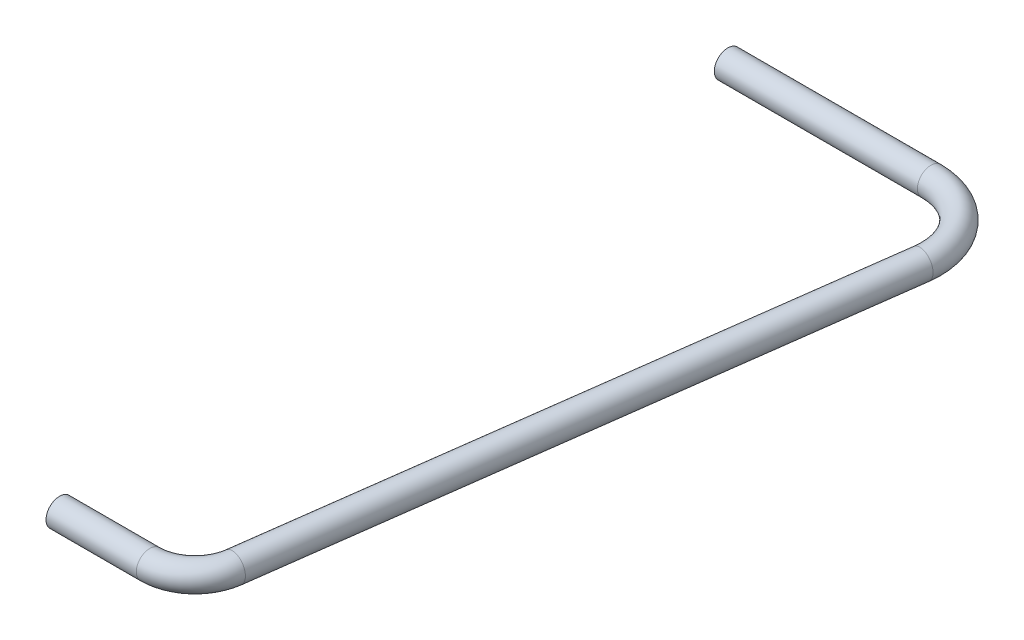
ISO-10303-21;
HEADER;
FILE_DESCRIPTION(('STEP AP214'),'2;1');
FILE_NAME('part.step','',(''),(''),'','','');
FILE_SCHEMA(('AUTOMOTIVE_DESIGN { 1 0 10303 214 1 1 1 1 }'));
ENDSEC;
DATA;
#1=APPLICATION_CONTEXT('core data for automotive mechanical design processes');
#2=APPLICATION_PROTOCOL_DEFINITION('international standard','automotive_design',2000,#1);
#3=PRODUCT_CONTEXT('',#1,'mechanical');
#4=PRODUCT('Part','Part','',(#3));
#5=PRODUCT_RELATED_PRODUCT_CATEGORY('part','',(#4));
#6=PRODUCT_DEFINITION_FORMATION('','',#4);
#7=PRODUCT_DEFINITION_CONTEXT('part definition',#1,'design');
#8=PRODUCT_DEFINITION('design','',#6,#7);
#9=PRODUCT_DEFINITION_SHAPE('','',#8);
#10=(LENGTH_UNIT() NAMED_UNIT(*) SI_UNIT(.MILLI.,.METRE.));
#11=(NAMED_UNIT(*) PLANE_ANGLE_UNIT() SI_UNIT($,.RADIAN.));
#12=(NAMED_UNIT(*) SI_UNIT($,.STERADIAN.) SOLID_ANGLE_UNIT());
#13=UNCERTAINTY_MEASURE_WITH_UNIT(LENGTH_MEASURE(1.E-05),#10,'distance_accuracy_value','');
#14=(GEOMETRIC_REPRESENTATION_CONTEXT(3) GLOBAL_UNCERTAINTY_ASSIGNED_CONTEXT((#13)) GLOBAL_UNIT_ASSIGNED_CONTEXT((#10,
#11,#12)) REPRESENTATION_CONTEXT('',''));
#15=CARTESIAN_POINT('',(0.,0.,0.));
#16=DIRECTION('',(0.,0.,1.));
#17=DIRECTION('',(1.,0.,0.));
#18=AXIS2_PLACEMENT_3D('',#15,#16,#17);
#19=CARTESIAN_POINT('',(-0.572453608804365,0.,-78.5923062806177));
#20=DIRECTION('',(-1.,0.,0.));
#21=DIRECTION('',(0.,0.,1.));
#22=AXIS2_PLACEMENT_3D('',#19,#20,#21);
#23=PLANE('',#22);
#24=CARTESIAN_POINT('',(-0.572453608804365,0.,-78.5923062806177));
#25=DIRECTION('',(-1.,0.,0.));
#26=DIRECTION('',(0.,0.,1.));
#27=AXIS2_PLACEMENT_3D('',#24,#25,#26);
#28=CIRCLE('',#27,3.);
#29=CARTESIAN_POINT('',(-0.572453608804363,0.,-75.5923062806177));
#30=VERTEX_POINT('',#29);
#31=EDGE_CURVE('E71',#30,#30,#28,.T.);
#32=ORIENTED_EDGE('',*,*,#31,.T.);
#33=EDGE_LOOP('',(#32));
#34=FACE_BOUND('',#33,.T.);
#35=ADVANCED_FACE('F49',(#34),#23,.T.);
#36=CARTESIAN_POINT('',(-12.5724536088044,0.,-238.592306280618));
#37=DIRECTION('',(1.,0.,0.));
#38=DIRECTION('',(0.,0.,-1.));
#39=AXIS2_PLACEMENT_3D('',#36,#37,#38);
#40=PLANE('',#39);
#41=CARTESIAN_POINT('',(-12.5724536088044,0.,-238.592306280618));
#42=DIRECTION('',(1.,0.,0.));
#43=DIRECTION('',(0.,0.,-1.));
#44=AXIS2_PLACEMENT_3D('',#41,#42,#43);
#45=CIRCLE('',#44,3.);
#46=CARTESIAN_POINT('',(-12.5724536088044,0.,-241.592306280618));
#47=VERTEX_POINT('',#46);
#48=EDGE_CURVE('E11',#47,#47,#45,.T.);
#49=ORIENTED_EDGE('',*,*,#48,.F.);
#50=EDGE_LOOP('',(#49));
#51=FACE_BOUND('',#50,.T.);
#52=ADVANCED_FACE('F79',(#51),#40,.F.);
#53=CARTESIAN_POINT('',(-0.572453608804365,0.,-78.5923062806177));
#54=DIRECTION('',(1.,0.,0.));
#55=DIRECTION('',(0.,0.,-1.));
#56=AXIS2_PLACEMENT_3D('',#53,#54,#55);
#57=CYLINDRICAL_SURFACE('',#56,3.);
#58=CARTESIAN_POINT('',(19.4275463911956,0.,-78.5923062806177));
#59=DIRECTION('',(-1.,0.,0.));
#60=DIRECTION('',(0.,0.,1.));
#61=AXIS2_PLACEMENT_3D('',#58,#59,#60);
#62=CIRCLE('',#61,3.);
#63=CARTESIAN_POINT('',(19.4275463911956,0.,-75.5923062806177));
#64=VERTEX_POINT('',#63);
#65=EDGE_CURVE('E68',#64,#64,#62,.T.);
#66=ORIENTED_EDGE('',*,*,#65,.T.);
#67=EDGE_LOOP('',(#66));
#68=FACE_BOUND('',#67,.T.);
#69=ORIENTED_EDGE('',*,*,#31,.F.);
#70=EDGE_LOOP('',(#69));
#71=FACE_BOUND('',#70,.T.);
#72=ADVANCED_FACE('F76',(#68,#71),#57,.T.);
#73=CARTESIAN_POINT('',(19.4275463911956,0.,-88.5923062806177));
#74=DIRECTION('',(0.,1.,0.));
#75=DIRECTION('',(0.,0.,1.));
#76=AXIS2_PLACEMENT_3D('',#73,#74,#75);
#77=TOROIDAL_SURFACE('',#76,10.,3.);
#78=CARTESIAN_POINT('',(29.3393971778021,0.,-87.2674613900556));
#79=DIRECTION('',(-0.13248448905621,0.,0.991185078660648));
#80=DIRECTION('',(0.991185078660648,0.,0.13248448905621));
#81=AXIS2_PLACEMENT_3D('',#78,#79,#80);
#82=CIRCLE('',#81,3.);
#83=CARTESIAN_POINT('',(32.3129524137841,0.,-86.8700079228869));
#84=VERTEX_POINT('',#83);
#85=EDGE_CURVE('E63',#84,#84,#82,.T.);
#86=CARTESIAN_POINT('',(19.4275463911956,0.,-88.5923062806177));
#87=DIRECTION('',(0.,1.,0.));
#88=DIRECTION('',(0.,0.,1.));
#89=AXIS2_PLACEMENT_3D('',#86,#87,#88);
#90=CIRCLE('',#89,13.);
#91=EDGE_CURVE('',#64,#84,#90,.T.);
#92=ORIENTED_EDGE('',*,*,#65,.F.);
#93=ORIENTED_EDGE('',*,*,#85,.T.);
#94=ORIENTED_EDGE('',*,*,#91,.T.);
#95=ORIENTED_EDGE('',*,*,#91,.F.);
#96=EDGE_LOOP('',(#92,#94,#93,#95));
#97=FACE_BOUND('',#96,.T.);
#98=ADVANCED_FACE('F78',(#97),#77,.T.);
#99=CARTESIAN_POINT('',(29.3393971778021,0.,-87.2674613900556));
#100=DIRECTION('',(0.132484489056211,0.,-0.991185078660648));
#101=DIRECTION('',(-0.991185078660648,0.,-0.132484489056211));
#102=AXIS2_PLACEMENT_3D('',#99,#100,#101);
#103=CYLINDRICAL_SURFACE('',#102,3.);
#104=CARTESIAN_POINT('',(47.2953225711054,0.,-221.605038944774));
#105=DIRECTION('',(-0.132484489056211,0.,0.991185078660648));
#106=DIRECTION('',(0.991185078660648,0.,0.132484489056211));
#107=AXIS2_PLACEMENT_3D('',#104,#105,#106);
#108=CIRCLE('',#107,3.);
#109=CARTESIAN_POINT('',(50.2688778070873,0.,-221.207585477606));
#110=VERTEX_POINT('',#109);
#111=EDGE_CURVE('E59',#110,#110,#108,.T.);
#112=ORIENTED_EDGE('',*,*,#111,.T.);
#113=EDGE_LOOP('',(#112));
#114=FACE_BOUND('',#113,.T.);
#115=ORIENTED_EDGE('',*,*,#85,.F.);
#116=EDGE_LOOP('',(#115));
#117=FACE_BOUND('',#116,.T.);
#118=ADVANCED_FACE('F86',(#114,#117),#103,.T.);
#119=CARTESIAN_POINT('',(32.4275463911956,0.,-223.592306280618));
#120=DIRECTION('',(0.,1.,0.));
#121=DIRECTION('',(0.,0.,1.));
#122=AXIS2_PLACEMENT_3D('',#119,#120,#121);
#123=TOROIDAL_SURFACE('',#122,15.,3.);
#124=CARTESIAN_POINT('',(32.4275463911956,0.,-238.592306280618));
#125=DIRECTION('',(1.,0.,0.));
#126=DIRECTION('',(0.,0.,-1.));
#127=AXIS2_PLACEMENT_3D('',#124,#125,#126);
#128=CIRCLE('',#127,3.);
#129=CARTESIAN_POINT('',(32.4275463911956,0.,-241.592306280618));
#130=VERTEX_POINT('',#129);
#131=EDGE_CURVE('E55',#130,#130,#128,.T.);
#132=CARTESIAN_POINT('',(32.4275463911956,0.,-223.592306280618));
#133=DIRECTION('',(0.,1.,0.));
#134=DIRECTION('',(0.,0.,1.));
#135=AXIS2_PLACEMENT_3D('',#132,#133,#134);
#136=CIRCLE('',#135,18.);
#137=EDGE_CURVE('',#110,#130,#136,.T.);
#138=ORIENTED_EDGE('',*,*,#111,.F.);
#139=ORIENTED_EDGE('',*,*,#131,.T.);
#140=ORIENTED_EDGE('',*,*,#137,.T.);
#141=ORIENTED_EDGE('',*,*,#137,.F.);
#142=EDGE_LOOP('',(#138,#140,#139,#141));
#143=FACE_BOUND('',#142,.T.);
#144=ADVANCED_FACE('F92',(#143),#123,.T.);
#145=CARTESIAN_POINT('',(32.4275463911956,0.,-238.592306280618));
#146=DIRECTION('',(-1.,0.,0.));
#147=DIRECTION('',(0.,0.,1.));
#148=AXIS2_PLACEMENT_3D('',#145,#146,#147);
#149=CYLINDRICAL_SURFACE('',#148,3.);
#150=ORIENTED_EDGE('',*,*,#48,.T.);
#151=EDGE_LOOP('',(#150));
#152=FACE_BOUND('',#151,.T.);
#153=ORIENTED_EDGE('',*,*,#131,.F.);
#154=EDGE_LOOP('',(#153));
#155=FACE_BOUND('',#154,.T.);
#156=ADVANCED_FACE('F90',(#152,#155),#149,.T.);
#157=CLOSED_SHELL('',(#35,#52,#72,#98,#118,#144,#156));
#158=MANIFOLD_SOLID_BREP('B2',#157);
#159=ADVANCED_BREP_SHAPE_REPRESENTATION('',(#18,#158),#14);
#160=SHAPE_DEFINITION_REPRESENTATION(#9,#159);
ENDSEC;
END-ISO-10303-21;
